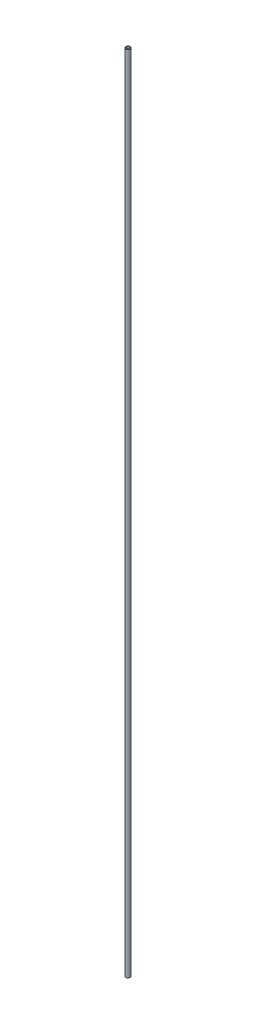
ISO-10303-21;
HEADER;
FILE_DESCRIPTION(('STEP AP214'),'2;1');
FILE_NAME('part.step','',(''),(''),'','','');
FILE_SCHEMA(('AUTOMOTIVE_DESIGN { 1 0 10303 214 1 1 1 1 }'));
ENDSEC;
DATA;
#1=APPLICATION_CONTEXT('core data for automotive mechanical design processes');
#2=APPLICATION_PROTOCOL_DEFINITION('international standard','automotive_design',2000,#1);
#3=PRODUCT_CONTEXT('',#1,'mechanical');
#4=PRODUCT('Part','Part','',(#3));
#5=PRODUCT_RELATED_PRODUCT_CATEGORY('part','',(#4));
#6=PRODUCT_DEFINITION_FORMATION('','',#4);
#7=PRODUCT_DEFINITION_CONTEXT('part definition',#1,'design');
#8=PRODUCT_DEFINITION('design','',#6,#7);
#9=PRODUCT_DEFINITION_SHAPE('','',#8);
#10=(LENGTH_UNIT() NAMED_UNIT(*) SI_UNIT(.MILLI.,.METRE.));
#11=(NAMED_UNIT(*) PLANE_ANGLE_UNIT() SI_UNIT($,.RADIAN.));
#12=(NAMED_UNIT(*) SI_UNIT($,.STERADIAN.) SOLID_ANGLE_UNIT());
#13=UNCERTAINTY_MEASURE_WITH_UNIT(LENGTH_MEASURE(1.E-05),#10,'distance_accuracy_value','');
#14=(GEOMETRIC_REPRESENTATION_CONTEXT(3) GLOBAL_UNCERTAINTY_ASSIGNED_CONTEXT((#13)) GLOBAL_UNIT_ASSIGNED_CONTEXT((#10,
#11,#12)) REPRESENTATION_CONTEXT('',''));
#15=CARTESIAN_POINT('',(0.,0.,0.));
#16=DIRECTION('',(0.,0.,1.));
#17=DIRECTION('',(1.,0.,0.));
#18=AXIS2_PLACEMENT_3D('',#15,#16,#17);
#19=CARTESIAN_POINT('',(0.,9144.,0.));
#20=DIRECTION('',(0.,1.,0.));
#21=DIRECTION('',(0.,0.,1.));
#22=AXIS2_PLACEMENT_3D('',#19,#20,#21);
#23=PLANE('',#22);
#24=CARTESIAN_POINT('',(0.,9144.,0.));
#25=DIRECTION('',(0.,1.,0.));
#26=DIRECTION('',(0.,0.,1.));
#27=AXIS2_PLACEMENT_3D('',#24,#25,#26);
#28=CIRCLE('',#27,24.13);
#29=CARTESIAN_POINT('',(0.,9144.,24.13));
#30=VERTEX_POINT('',#29);
#31=EDGE_CURVE('E10',#30,#30,#28,.T.);
#32=ORIENTED_EDGE('',*,*,#31,.T.);
#33=EDGE_LOOP('',(#32));
#34=FACE_BOUND('',#33,.T.);
#35=CARTESIAN_POINT('',(0.,9144.,0.));
#36=DIRECTION('',(0.,1.,0.));
#37=DIRECTION('',(0.,0.,1.));
#38=AXIS2_PLACEMENT_3D('',#35,#36,#37);
#39=CIRCLE('',#38,19.05);
#40=CARTESIAN_POINT('',(0.,9144.,19.05));
#41=VERTEX_POINT('',#40);
#42=EDGE_CURVE('E48',#41,#41,#39,.T.);
#43=ORIENTED_EDGE('',*,*,#42,.F.);
#44=EDGE_LOOP('',(#43));
#45=FACE_BOUND('',#44,.T.);
#46=ADVANCED_FACE('F37',(#34,#45),#23,.T.);
#47=CARTESIAN_POINT('',(0.,0.,0.));
#48=DIRECTION('',(0.,1.,0.));
#49=DIRECTION('',(0.,0.,1.));
#50=AXIS2_PLACEMENT_3D('',#47,#48,#49);
#51=PLANE('',#50);
#52=CARTESIAN_POINT('',(0.,0.,0.));
#53=DIRECTION('',(0.,1.,0.));
#54=DIRECTION('',(0.,0.,1.));
#55=AXIS2_PLACEMENT_3D('',#52,#53,#54);
#56=CIRCLE('',#55,24.13);
#57=CARTESIAN_POINT('',(0.,0.,24.13));
#58=VERTEX_POINT('',#57);
#59=EDGE_CURVE('E41',#58,#58,#56,.T.);
#60=ORIENTED_EDGE('',*,*,#59,.F.);
#61=EDGE_LOOP('',(#60));
#62=FACE_BOUND('',#61,.T.);
#63=CARTESIAN_POINT('',(0.,0.,0.));
#64=DIRECTION('',(0.,1.,0.));
#65=DIRECTION('',(0.,0.,1.));
#66=AXIS2_PLACEMENT_3D('',#63,#64,#65);
#67=CIRCLE('',#66,19.05);
#68=CARTESIAN_POINT('',(0.,0.,19.05));
#69=VERTEX_POINT('',#68);
#70=EDGE_CURVE('E50',#69,#69,#67,.T.);
#71=ORIENTED_EDGE('',*,*,#70,.T.);
#72=EDGE_LOOP('',(#71));
#73=FACE_BOUND('',#72,.T.);
#74=ADVANCED_FACE('F60',(#62,#73),#51,.F.);
#75=CARTESIAN_POINT('',(0.,9144.,0.));
#76=DIRECTION('',(0.,-1.,0.));
#77=DIRECTION('',(0.,0.,-1.));
#78=AXIS2_PLACEMENT_3D('',#75,#76,#77);
#79=CYLINDRICAL_SURFACE('',#78,24.13);
#80=ORIENTED_EDGE('',*,*,#31,.F.);
#81=EDGE_LOOP('',(#80));
#82=FACE_BOUND('',#81,.T.);
#83=ORIENTED_EDGE('',*,*,#59,.T.);
#84=EDGE_LOOP('',(#83));
#85=FACE_BOUND('',#84,.T.);
#86=ADVANCED_FACE('F39',(#82,#85),#79,.T.);
#87=CARTESIAN_POINT('',(0.,9144.,0.));
#88=DIRECTION('',(0.,-1.,0.));
#89=DIRECTION('',(0.,0.,-1.));
#90=AXIS2_PLACEMENT_3D('',#87,#88,#89);
#91=CYLINDRICAL_SURFACE('',#90,19.05);
#92=ORIENTED_EDGE('',*,*,#42,.T.);
#93=EDGE_LOOP('',(#92));
#94=FACE_BOUND('',#93,.T.);
#95=ORIENTED_EDGE('',*,*,#70,.F.);
#96=EDGE_LOOP('',(#95));
#97=FACE_BOUND('',#96,.T.);
#98=ADVANCED_FACE('F56',(#94,#97),#91,.F.);
#99=CLOSED_SHELL('',(#46,#74,#86,#98));
#100=MANIFOLD_SOLID_BREP('B2',#99);
#101=ADVANCED_BREP_SHAPE_REPRESENTATION('',(#18,#100),#14);
#102=SHAPE_DEFINITION_REPRESENTATION(#9,#101);
ENDSEC;
END-ISO-10303-21;
